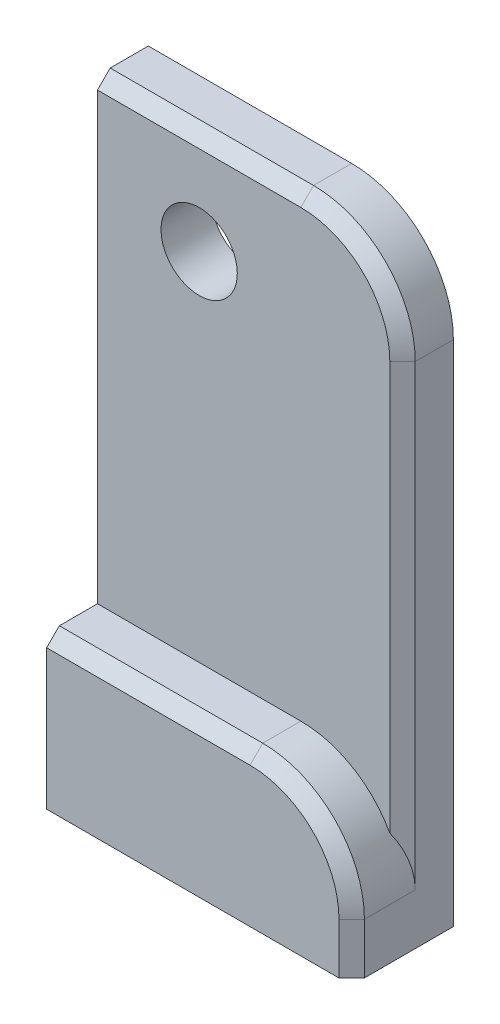
ISO-10303-21;
HEADER;
FILE_DESCRIPTION(('STEP AP214'),'2;1');
FILE_NAME('part.step','',(''),(''),'','','');
FILE_SCHEMA(('AUTOMOTIVE_DESIGN { 1 0 10303 214 1 1 1 1 }'));
ENDSEC;
DATA;
#1=APPLICATION_CONTEXT('core data for automotive mechanical design processes');
#2=APPLICATION_PROTOCOL_DEFINITION('international standard','automotive_design',2000,#1);
#3=PRODUCT_CONTEXT('',#1,'mechanical');
#4=PRODUCT('Part','Part','',(#3));
#5=PRODUCT_RELATED_PRODUCT_CATEGORY('part','',(#4));
#6=PRODUCT_DEFINITION_FORMATION('','',#4);
#7=PRODUCT_DEFINITION_CONTEXT('part definition',#1,'design');
#8=PRODUCT_DEFINITION('design','',#6,#7);
#9=PRODUCT_DEFINITION_SHAPE('','',#8);
#10=(LENGTH_UNIT() NAMED_UNIT(*) SI_UNIT(.MILLI.,.METRE.));
#11=(NAMED_UNIT(*) PLANE_ANGLE_UNIT() SI_UNIT($,.RADIAN.));
#12=(NAMED_UNIT(*) SI_UNIT($,.STERADIAN.) SOLID_ANGLE_UNIT());
#13=UNCERTAINTY_MEASURE_WITH_UNIT(LENGTH_MEASURE(1.E-05),#10,'distance_accuracy_value','');
#14=(GEOMETRIC_REPRESENTATION_CONTEXT(3) GLOBAL_UNCERTAINTY_ASSIGNED_CONTEXT((#13)) GLOBAL_UNIT_ASSIGNED_CONTEXT((#10,
#11,#12)) REPRESENTATION_CONTEXT('',''));
#15=CARTESIAN_POINT('',(0.,0.,0.));
#16=DIRECTION('',(0.,0.,1.));
#17=DIRECTION('',(1.,0.,0.));
#18=AXIS2_PLACEMENT_3D('',#15,#16,#17);
#19=CARTESIAN_POINT('',(0.,0.,12.7));
#20=DIRECTION('',(-1.,0.,0.));
#21=DIRECTION('',(0.,0.,1.));
#22=AXIS2_PLACEMENT_3D('',#19,#20,#21);
#23=PLANE('',#22);
#24=DIRECTION('',(0.,-0.707106781186544,0.707106781186551));
#25=VECTOR('',#24,1.);
#26=CARTESIAN_POINT('',(0.,22.0164487757863,34.7164487757861));
#27=LINE('',#26,#25);
#28=CARTESIAN_POINT('',(0.,33.8728975515724,22.86));
#29=VERTEX_POINT('',#28);
#30=CARTESIAN_POINT('',(0.,35.56,21.1728975515723));
#31=VERTEX_POINT('',#30);
#32=EDGE_CURVE('E270',#29,#31,#27,.F.);
#33=ORIENTED_EDGE('',*,*,#32,.F.);
#34=DIRECTION('',(0.,-1.,0.));
#35=VECTOR('',#34,1.);
#36=CARTESIAN_POINT('',(0.,0.,22.86));
#37=LINE('',#36,#35);
#38=CARTESIAN_POINT('',(0.,0.,22.86));
#39=VERTEX_POINT('',#38);
#40=EDGE_CURVE('E268',#29,#39,#37,.T.);
#41=ORIENTED_EDGE('',*,*,#40,.T.);
#42=DIRECTION('',(0.,0.,-1.));
#43=VECTOR('',#42,1.);
#44=CARTESIAN_POINT('',(0.,0.,12.7));
#45=LINE('',#44,#43);
#46=CARTESIAN_POINT('',(0.,0.,25.4));
#47=VERTEX_POINT('',#46);
#48=EDGE_CURVE('E339',#47,#39,#45,.T.);
#49=ORIENTED_EDGE('',*,*,#48,.F.);
#50=DIRECTION('',(0.,-1.,0.));
#51=VECTOR('',#50,1.);
#52=CARTESIAN_POINT('',(0.,0.,25.4));
#53=LINE('',#52,#51);
#54=CARTESIAN_POINT('',(0.,34.925,25.4));
#55=VERTEX_POINT('',#54);
#56=EDGE_CURVE('E312',#55,#47,#53,.T.);
#57=ORIENTED_EDGE('',*,*,#56,.F.);
#58=DIRECTION('',(0.,-0.707106781186544,0.707106781186551));
#59=VECTOR('',#58,1.);
#60=CARTESIAN_POINT('',(0.,23.8125000000002,36.5125));
#61=LINE('',#60,#59);
#62=CARTESIAN_POINT('',(0.,38.1,22.225));
#63=VERTEX_POINT('',#62);
#64=EDGE_CURVE('E376',#55,#63,#61,.F.);
#65=ORIENTED_EDGE('',*,*,#64,.T.);
#66=DIRECTION('',(0.,0.,-1.));
#67=VECTOR('',#66,1.);
#68=CARTESIAN_POINT('',(0.,38.1,25.4));
#69=LINE('',#68,#67);
#70=CARTESIAN_POINT('',(0.,38.1,12.7));
#71=VERTEX_POINT('',#70);
#72=EDGE_CURVE('E317',#63,#71,#69,.T.);
#73=ORIENTED_EDGE('',*,*,#72,.T.);
#74=DIRECTION('',(0.,1.,0.));
#75=VECTOR('',#74,1.);
#76=CARTESIAN_POINT('',(0.,0.,12.7));
#77=LINE('',#76,#75);
#78=CARTESIAN_POINT('',(0.,149.225,12.7));
#79=VERTEX_POINT('',#78);
#80=EDGE_CURVE('E322',#71,#79,#77,.T.);
#81=ORIENTED_EDGE('',*,*,#80,.T.);
#82=DIRECTION('',(0.,-0.707106781186549,0.707106781186546));
#83=VECTOR('',#82,1.);
#84=CARTESIAN_POINT('',(0.,74.6124999999997,87.3125));
#85=LINE('',#84,#83);
#86=CARTESIAN_POINT('',(0.,152.4,9.52499999999995));
#87=VERTEX_POINT('',#86);
#88=EDGE_CURVE('E374',#79,#87,#85,.F.);
#89=ORIENTED_EDGE('',*,*,#88,.T.);
#90=DIRECTION('',(0.,0.,-1.));
#91=VECTOR('',#90,1.);
#92=CARTESIAN_POINT('',(0.,152.4,12.7));
#93=LINE('',#92,#91);
#94=CARTESIAN_POINT('',(0.,152.4,0.));
#95=VERTEX_POINT('',#94);
#96=EDGE_CURVE('E335',#87,#95,#93,.T.);
#97=ORIENTED_EDGE('',*,*,#96,.T.);
#98=DIRECTION('',(0.,1.,0.));
#99=VECTOR('',#98,1.);
#100=CARTESIAN_POINT('',(0.,0.,0.));
#101=LINE('',#100,#99);
#102=CARTESIAN_POINT('',(0.,149.86,0.));
#103=VERTEX_POINT('',#102);
#104=EDGE_CURVE('E326',#103,#95,#101,.T.);
#105=ORIENTED_EDGE('',*,*,#104,.F.);
#106=DIRECTION('',(0.,0.,-1.));
#107=VECTOR('',#106,1.);
#108=CARTESIAN_POINT('',(0.,149.86,12.7));
#109=LINE('',#108,#107);
#110=CARTESIAN_POINT('',(0.,149.86,8.47289755157226));
#111=VERTEX_POINT('',#110);
#112=EDGE_CURVE('E247',#111,#103,#109,.T.);
#113=ORIENTED_EDGE('',*,*,#112,.F.);
#114=DIRECTION('',(0.,-0.707106781186549,0.707106781186546));
#115=VECTOR('',#114,1.);
#116=CARTESIAN_POINT('',(0.,72.8164487757858,85.5164487757861));
#117=LINE('',#116,#115);
#118=CARTESIAN_POINT('',(0.,148.172897551572,10.16));
#119=VERTEX_POINT('',#118);
#120=EDGE_CURVE('E204',#119,#111,#117,.F.);
#121=ORIENTED_EDGE('',*,*,#120,.F.);
#122=DIRECTION('',(0.,1.,0.));
#123=VECTOR('',#122,1.);
#124=CARTESIAN_POINT('',(0.,0.,10.16));
#125=LINE('',#124,#123);
#126=CARTESIAN_POINT('',(0.,35.56,10.16));
#127=VERTEX_POINT('',#126);
#128=EDGE_CURVE('E288',#127,#119,#125,.T.);
#129=ORIENTED_EDGE('',*,*,#128,.F.);
#130=DIRECTION('',(0.,0.,-1.));
#131=VECTOR('',#130,1.);
#132=CARTESIAN_POINT('',(0.,35.56,25.4));
#133=LINE('',#132,#131);
#134=EDGE_CURVE('E284',#31,#127,#133,.T.);
#135=ORIENTED_EDGE('',*,*,#134,.F.);
#136=EDGE_LOOP('',(#33,#41,#49,#57,#65,#73,#81,#89,#97,#105,#113,#121,#129,#135));
#137=FACE_BOUND('',#136,.T.);
#138=ADVANCED_FACE('F40',(#137),#23,.T.);
#139=CARTESIAN_POINT('',(0.,0.,0.));
#140=DIRECTION('',(0.,0.,1.));
#141=DIRECTION('',(1.,0.,0.));
#142=AXIS2_PLACEMENT_3D('',#139,#140,#141);
#143=PLANE('',#142);
#144=CARTESIAN_POINT('',(25.4,127.,0.));
#145=DIRECTION('',(0.,0.,1.));
#146=DIRECTION('',(1.,0.,0.));
#147=AXIS2_PLACEMENT_3D('',#144,#145,#146);
#148=CIRCLE('',#147,9.525);
#149=CARTESIAN_POINT('',(34.925,127.,0.));
#150=VERTEX_POINT('',#149);
#151=EDGE_CURVE('E304',#150,#150,#148,.T.);
#152=ORIENTED_EDGE('',*,*,#151,.T.);
#153=EDGE_LOOP('',(#152));
#154=FACE_BOUND('',#153,.T.);
#155=CARTESIAN_POINT('',(25.4,127.,0.));
#156=DIRECTION('',(0.,0.,1.));
#157=DIRECTION('',(1.,0.,0.));
#158=AXIS2_PLACEMENT_3D('',#155,#156,#157);
#159=CIRCLE('',#158,12.065);
#160=CARTESIAN_POINT('',(37.465,127.,0.));
#161=VERTEX_POINT('',#160);
#162=EDGE_CURVE('E258',#161,#161,#159,.T.);
#163=ORIENTED_EDGE('',*,*,#162,.F.);
#164=EDGE_LOOP('',(#163));
#165=FACE_BOUND('',#164,.T.);
#166=ADVANCED_FACE('F486',(#154,#165),#143,.F.);
#167=DIRECTION('',(1.,0.,0.));
#168=VECTOR('',#167,1.);
#169=CARTESIAN_POINT('',(0.,149.86,0.));
#170=LINE('',#169,#168);
#171=CARTESIAN_POINT('',(50.8,149.86,0.));
#172=VERTEX_POINT('',#171);
#173=EDGE_CURVE('E214',#103,#172,#170,.T.);
#174=ORIENTED_EDGE('',*,*,#173,.F.);
#175=ORIENTED_EDGE('',*,*,#104,.T.);
#176=DIRECTION('',(1.,0.,0.));
#177=VECTOR('',#176,1.);
#178=CARTESIAN_POINT('',(0.,152.4,0.));
#179=LINE('',#178,#177);
#180=CARTESIAN_POINT('',(50.8,152.4,0.));
#181=VERTEX_POINT('',#180);
#182=EDGE_CURVE('E321',#95,#181,#179,.T.);
#183=ORIENTED_EDGE('',*,*,#182,.T.);
#184=CARTESIAN_POINT('',(50.8,127.,0.));
#185=DIRECTION('',(0.,0.,1.));
#186=DIRECTION('',(1.,0.,0.));
#187=AXIS2_PLACEMENT_3D('',#184,#185,#186);
#188=CIRCLE('',#187,25.4);
#189=CARTESIAN_POINT('',(76.2,127.,0.));
#190=VERTEX_POINT('',#189);
#191=EDGE_CURVE('E353',#181,#190,#188,.F.);
#192=ORIENTED_EDGE('',*,*,#191,.T.);
#193=DIRECTION('',(0.,1.,0.));
#194=VECTOR('',#193,1.);
#195=CARTESIAN_POINT('',(76.2,0.,0.));
#196=LINE('',#195,#194);
#197=CARTESIAN_POINT('',(76.2,0.,0.));
#198=VERTEX_POINT('',#197);
#199=EDGE_CURVE('E329',#198,#190,#196,.T.);
#200=ORIENTED_EDGE('',*,*,#199,.F.);
#201=DIRECTION('',(1.,0.,0.));
#202=VECTOR('',#201,1.);
#203=CARTESIAN_POINT('',(0.,0.,0.));
#204=LINE('',#203,#202);
#205=CARTESIAN_POINT('',(73.66,0.,0.));
#206=VERTEX_POINT('',#205);
#207=EDGE_CURVE('E332',#206,#198,#204,.T.);
#208=ORIENTED_EDGE('',*,*,#207,.F.);
#209=DIRECTION('',(0.,1.,0.));
#210=VECTOR('',#209,1.);
#211=CARTESIAN_POINT('',(73.66,0.,0.));
#212=LINE('',#211,#210);
#213=CARTESIAN_POINT('',(73.66,127.,0.));
#214=VERTEX_POINT('',#213);
#215=EDGE_CURVE('E283',#206,#214,#212,.T.);
#216=ORIENTED_EDGE('',*,*,#215,.T.);
#217=CARTESIAN_POINT('',(50.8,127.,0.));
#218=DIRECTION('',(0.,0.,1.));
#219=DIRECTION('',(1.,0.,0.));
#220=AXIS2_PLACEMENT_3D('',#217,#218,#219);
#221=CIRCLE('',#220,22.86);
#222=EDGE_CURVE('E218',#172,#214,#221,.F.);
#223=ORIENTED_EDGE('',*,*,#222,.F.);
#224=EDGE_LOOP('',(#174,#175,#183,#192,#200,#208,#216,#223));
#225=FACE_BOUND('',#224,.T.);
#226=ADVANCED_FACE('F436',(#225),#143,.F.);
#227=CARTESIAN_POINT('',(0.,152.4,12.7));
#228=DIRECTION('',(0.,1.,0.));
#229=DIRECTION('',(0.,0.,1.));
#230=AXIS2_PLACEMENT_3D('',#227,#228,#229);
#231=PLANE('',#230);
#232=ORIENTED_EDGE('',*,*,#96,.F.);
#233=DIRECTION('',(1.,0.,0.));
#234=VECTOR('',#233,1.);
#235=CARTESIAN_POINT('',(0.,152.4,9.52499999999995));
#236=LINE('',#235,#234);
#237=CARTESIAN_POINT('',(50.8,152.4,9.52499999999995));
#238=VERTEX_POINT('',#237);
#239=EDGE_CURVE('E50',#87,#238,#236,.T.);
#240=ORIENTED_EDGE('',*,*,#239,.T.);
#241=DIRECTION('',(0.,0.,-1.));
#242=VECTOR('',#241,1.);
#243=CARTESIAN_POINT('',(50.8,152.4,0.));
#244=LINE('',#243,#242);
#245=EDGE_CURVE('E351',#238,#181,#244,.T.);
#246=ORIENTED_EDGE('',*,*,#245,.T.);
#247=ORIENTED_EDGE('',*,*,#182,.F.);
#248=EDGE_LOOP('',(#232,#240,#246,#247));
#249=FACE_BOUND('',#248,.T.);
#250=ADVANCED_FACE('F434',(#249),#231,.T.);
#251=CARTESIAN_POINT('',(0.,0.,12.7));
#252=DIRECTION('',(0.,1.,0.));
#253=DIRECTION('',(0.,0.,1.));
#254=AXIS2_PLACEMENT_3D('',#251,#252,#253);
#255=PLANE('',#254);
#256=DIRECTION('',(0.707106781186544,0.,-0.707106781186551));
#257=VECTOR('',#256,1.);
#258=CARTESIAN_POINT('',(71.2289487757862,0.,23.6039487757862));
#259=LINE('',#258,#257);
#260=CARTESIAN_POINT('',(73.66,0.,21.1728975515724));
#261=VERTEX_POINT('',#260);
#262=CARTESIAN_POINT('',(71.9728975515724,0.,22.86));
#263=VERTEX_POINT('',#262);
#264=EDGE_CURVE('E241',#261,#263,#259,.F.);
#265=ORIENTED_EDGE('',*,*,#264,.F.);
#266=DIRECTION('',(0.,0.,-1.));
#267=VECTOR('',#266,1.);
#268=CARTESIAN_POINT('',(73.66,0.,12.7));
#269=LINE('',#268,#267);
#270=EDGE_CURVE('E281',#261,#206,#269,.T.);
#271=ORIENTED_EDGE('',*,*,#270,.T.);
#272=ORIENTED_EDGE('',*,*,#207,.T.);
#273=DIRECTION('',(0.,0.,-1.));
#274=VECTOR('',#273,1.);
#275=CARTESIAN_POINT('',(76.2,0.,12.7));
#276=LINE('',#275,#274);
#277=CARTESIAN_POINT('',(76.2,0.,22.225));
#278=VERTEX_POINT('',#277);
#279=EDGE_CURVE('E325',#278,#198,#276,.T.);
#280=ORIENTED_EDGE('',*,*,#279,.F.);
#281=DIRECTION('',(0.707106781186544,0.,-0.707106781186551));
#282=VECTOR('',#281,1.);
#283=CARTESIAN_POINT('',(73.025,0.,25.4));
#284=LINE('',#283,#282);
#285=CARTESIAN_POINT('',(73.025,0.,25.4));
#286=VERTEX_POINT('',#285);
#287=EDGE_CURVE('E370',#278,#286,#284,.F.);
#288=ORIENTED_EDGE('',*,*,#287,.T.);
#289=DIRECTION('',(1.,0.,0.));
#290=VECTOR('',#289,1.);
#291=CARTESIAN_POINT('',(0.,0.,25.4));
#292=LINE('',#291,#290);
#293=EDGE_CURVE('E314',#47,#286,#292,.T.);
#294=ORIENTED_EDGE('',*,*,#293,.F.);
#295=ORIENTED_EDGE('',*,*,#48,.T.);
#296=DIRECTION('',(1.,0.,0.));
#297=VECTOR('',#296,1.);
#298=CARTESIAN_POINT('',(0.,0.,22.86));
#299=LINE('',#298,#297);
#300=EDGE_CURVE('E292',#39,#263,#299,.T.);
#301=ORIENTED_EDGE('',*,*,#300,.T.);
#302=EDGE_LOOP('',(#265,#271,#272,#280,#288,#294,#295,#301));
#303=FACE_BOUND('',#302,.T.);
#304=ADVANCED_FACE('F459',(#303),#255,.F.);
#305=CARTESIAN_POINT('',(76.2,0.,12.7));
#306=DIRECTION('',(-1.,0.,0.));
#307=DIRECTION('',(0.,0.,1.));
#308=AXIS2_PLACEMENT_3D('',#305,#306,#307);
#309=PLANE('',#308);
#310=DIRECTION('',(0.,0.,-1.));
#311=VECTOR('',#310,1.);
#312=CARTESIAN_POINT('',(76.2,12.7,12.7));
#313=LINE('',#312,#311);
#314=CARTESIAN_POINT('',(76.2,12.7,9.52499999999995));
#315=VERTEX_POINT('',#314);
#316=CARTESIAN_POINT('',(76.2,12.7,22.225));
#317=VERTEX_POINT('',#316);
#318=EDGE_CURVE('E348',#315,#317,#313,.F.);
#319=ORIENTED_EDGE('',*,*,#318,.T.);
#320=DIRECTION('',(0.,-1.,0.));
#321=VECTOR('',#320,1.);
#322=CARTESIAN_POINT('',(76.2,0.,22.225));
#323=LINE('',#322,#321);
#324=EDGE_CURVE('E368',#317,#278,#323,.T.);
#325=ORIENTED_EDGE('',*,*,#324,.T.);
#326=ORIENTED_EDGE('',*,*,#279,.T.);
#327=ORIENTED_EDGE('',*,*,#199,.T.);
#328=DIRECTION('',(0.,0.,-1.));
#329=VECTOR('',#328,1.);
#330=CARTESIAN_POINT('',(76.2,127.,12.7));
#331=LINE('',#330,#329);
#332=CARTESIAN_POINT('',(76.2,127.,9.52499999999995));
#333=VERTEX_POINT('',#332);
#334=EDGE_CURVE('E345',#190,#333,#331,.F.);
#335=ORIENTED_EDGE('',*,*,#334,.T.);
#336=DIRECTION('',(0.,-1.,0.));
#337=VECTOR('',#336,1.);
#338=CARTESIAN_POINT('',(76.2,12.7,9.52499999999995));
#339=LINE('',#338,#337);
#340=EDGE_CURVE('E365',#333,#315,#339,.T.);
#341=ORIENTED_EDGE('',*,*,#340,.T.);
#342=EDGE_LOOP('',(#319,#325,#326,#327,#335,#341));
#343=FACE_BOUND('',#342,.T.);
#344=ADVANCED_FACE('F427',(#343),#309,.F.);
#345=CARTESIAN_POINT('',(0.,0.,12.7));
#346=DIRECTION('',(0.,0.,1.));
#347=DIRECTION('',(1.,0.,0.));
#348=AXIS2_PLACEMENT_3D('',#345,#346,#347);
#349=PLANE('',#348);
#350=CARTESIAN_POINT('',(25.4,127.,12.7));
#351=DIRECTION('',(0.,0.,1.));
#352=DIRECTION('',(1.,0.,0.));
#353=AXIS2_PLACEMENT_3D('',#350,#351,#352);
#354=CIRCLE('',#353,9.525);
#355=CARTESIAN_POINT('',(34.925,127.,12.7));
#356=VERTEX_POINT('',#355);
#357=EDGE_CURVE('E308',#356,#356,#354,.T.);
#358=ORIENTED_EDGE('',*,*,#357,.F.);
#359=EDGE_LOOP('',(#358));
#360=FACE_BOUND('',#359,.T.);
#361=CARTESIAN_POINT('',(50.8,12.7,12.7));
#362=DIRECTION('',(0.,0.,1.));
#363=DIRECTION('',(1.,0.,0.));
#364=AXIS2_PLACEMENT_3D('',#361,#362,#363);
#365=CIRCLE('',#364,25.4);
#366=CARTESIAN_POINT('',(50.8,38.1,12.7));
#367=VERTEX_POINT('',#366);
#368=CARTESIAN_POINT('',(73.0249999999999,24.9967221242087,12.7));
#369=VERTEX_POINT('',#368);
#370=EDGE_CURVE('E355',#367,#369,#365,.F.);
#371=ORIENTED_EDGE('',*,*,#370,.T.);
#372=DIRECTION('',(0.,1.,0.));
#373=VECTOR('',#372,1.);
#374=CARTESIAN_POINT('',(73.0249999999999,127.,12.7));
#375=LINE('',#374,#373);
#376=CARTESIAN_POINT('',(73.0249999999999,127.,12.7));
#377=VERTEX_POINT('',#376);
#378=EDGE_CURVE('E384',#369,#377,#375,.T.);
#379=ORIENTED_EDGE('',*,*,#378,.T.);
#380=CARTESIAN_POINT('',(50.8,127.,12.7));
#381=DIRECTION('',(0.,0.,1.));
#382=DIRECTION('',(1.,0.,0.));
#383=AXIS2_PLACEMENT_3D('',#380,#381,#382);
#384=CIRCLE('',#383,22.2249999999999);
#385=CARTESIAN_POINT('',(50.8,149.225,12.7));
#386=VERTEX_POINT('',#385);
#387=EDGE_CURVE('E382',#377,#386,#384,.T.);
#388=ORIENTED_EDGE('',*,*,#387,.T.);
#389=DIRECTION('',(-1.,0.,0.));
#390=VECTOR('',#389,1.);
#391=CARTESIAN_POINT('',(0.,149.225,12.7));
#392=LINE('',#391,#390);
#393=EDGE_CURVE('E380',#386,#79,#392,.T.);
#394=ORIENTED_EDGE('',*,*,#393,.T.);
#395=ORIENTED_EDGE('',*,*,#80,.F.);
#396=DIRECTION('',(-1.,0.,0.));
#397=VECTOR('',#396,1.);
#398=CARTESIAN_POINT('',(0.,38.1,12.7));
#399=LINE('',#398,#397);
#400=EDGE_CURVE('E307',#367,#71,#399,.T.);
#401=ORIENTED_EDGE('',*,*,#400,.F.);
#402=EDGE_LOOP('',(#371,#379,#388,#394,#395,#401));
#403=FACE_BOUND('',#402,.T.);
#404=ADVANCED_FACE('F408',(#360,#403),#349,.T.);
#405=CARTESIAN_POINT('',(0.,38.1,25.4));
#406=DIRECTION('',(0.,-1.,0.));
#407=DIRECTION('',(0.,0.,-1.));
#408=AXIS2_PLACEMENT_3D('',#405,#406,#407);
#409=PLANE('',#408);
#410=ORIENTED_EDGE('',*,*,#72,.F.);
#411=DIRECTION('',(1.,0.,0.));
#412=VECTOR('',#411,1.);
#413=CARTESIAN_POINT('',(0.,38.1,22.225));
#414=LINE('',#413,#412);
#415=CARTESIAN_POINT('',(50.8,38.1,22.225));
#416=VERTEX_POINT('',#415);
#417=EDGE_CURVE('E378',#63,#416,#414,.T.);
#418=ORIENTED_EDGE('',*,*,#417,.T.);
#419=DIRECTION('',(0.,0.,-1.));
#420=VECTOR('',#419,1.);
#421=CARTESIAN_POINT('',(50.8,38.1,25.4));
#422=LINE('',#421,#420);
#423=EDGE_CURVE('E338',#416,#367,#422,.T.);
#424=ORIENTED_EDGE('',*,*,#423,.T.);
#425=ORIENTED_EDGE('',*,*,#400,.T.);
#426=EDGE_LOOP('',(#410,#418,#424,#425));
#427=FACE_BOUND('',#426,.T.);
#428=ADVANCED_FACE('F417',(#427),#409,.F.);
#429=CARTESIAN_POINT('',(0.,0.,25.4));
#430=DIRECTION('',(0.,0.,-1.));
#431=DIRECTION('',(-1.,0.,0.));
#432=AXIS2_PLACEMENT_3D('',#429,#430,#431);
#433=PLANE('',#432);
#434=ORIENTED_EDGE('',*,*,#293,.T.);
#435=DIRECTION('',(0.,1.,0.));
#436=VECTOR('',#435,1.);
#437=CARTESIAN_POINT('',(73.025,0.,25.4));
#438=LINE('',#437,#436);
#439=CARTESIAN_POINT('',(73.025,12.7,25.4));
#440=VERTEX_POINT('',#439);
#441=EDGE_CURVE('E362',#286,#440,#438,.T.);
#442=ORIENTED_EDGE('',*,*,#441,.T.);
#443=CARTESIAN_POINT('',(50.8,12.7,25.4));
#444=DIRECTION('',(0.,0.,-1.));
#445=DIRECTION('',(-1.,0.,0.));
#446=AXIS2_PLACEMENT_3D('',#443,#444,#445);
#447=CIRCLE('',#446,22.225);
#448=CARTESIAN_POINT('',(50.8,34.925,25.4));
#449=VERTEX_POINT('',#448);
#450=EDGE_CURVE('E360',#440,#449,#447,.F.);
#451=ORIENTED_EDGE('',*,*,#450,.T.);
#452=DIRECTION('',(-1.,0.,0.));
#453=VECTOR('',#452,1.);
#454=CARTESIAN_POINT('',(0.,34.925,25.4));
#455=LINE('',#454,#453);
#456=EDGE_CURVE('E358',#449,#55,#455,.T.);
#457=ORIENTED_EDGE('',*,*,#456,.T.);
#458=ORIENTED_EDGE('',*,*,#56,.T.);
#459=EDGE_LOOP('',(#434,#442,#451,#457,#458));
#460=FACE_BOUND('',#459,.T.);
#461=ADVANCED_FACE('F464',(#460),#433,.F.);
#462=CARTESIAN_POINT('',(25.4,127.,0.));
#463=DIRECTION('',(0.,0.,1.));
#464=DIRECTION('',(1.,0.,0.));
#465=AXIS2_PLACEMENT_3D('',#462,#463,#464);
#466=CYLINDRICAL_SURFACE('',#465,9.525);
#467=ORIENTED_EDGE('',*,*,#151,.F.);
#468=EDGE_LOOP('',(#467));
#469=FACE_BOUND('',#468,.T.);
#470=ORIENTED_EDGE('',*,*,#357,.T.);
#471=EDGE_LOOP('',(#470));
#472=FACE_BOUND('',#471,.T.);
#473=ADVANCED_FACE('F502',(#469,#472),#466,.F.);
#474=CARTESIAN_POINT('',(50.8,12.7,25.4));
#475=DIRECTION('',(0.,0.,-1.));
#476=DIRECTION('',(-1.,0.,0.));
#477=AXIS2_PLACEMENT_3D('',#474,#475,#476);
#478=CYLINDRICAL_SURFACE('',#477,25.4);
#479=ORIENTED_EDGE('',*,*,#423,.F.);
#480=CARTESIAN_POINT('',(50.8,12.7,22.225));
#481=DIRECTION('',(0.,0.,-1.));
#482=DIRECTION('',(-1.,0.,0.));
#483=AXIS2_PLACEMENT_3D('',#480,#481,#482);
#484=CIRCLE('',#483,25.4);
#485=EDGE_CURVE('E372',#416,#317,#484,.T.);
#486=ORIENTED_EDGE('',*,*,#485,.T.);
#487=ORIENTED_EDGE('',*,*,#318,.F.);
#488=CARTESIAN_POINT('',(50.8,12.7,34.9249999999998));
#489=DIRECTION('',(0.707106781186546,0.,0.707106781186549));
#490=DIRECTION('',(0.707106781186549,0.,-0.707106781186546));
#491=AXIS2_PLACEMENT_3D('',#488,#489,#490);
#492=ELLIPSE('',#491,35.9210244842765,25.4);
#493=EDGE_CURVE('E11',#315,#369,#492,.T.);
#494=ORIENTED_EDGE('',*,*,#493,.T.);
#495=ORIENTED_EDGE('',*,*,#370,.F.);
#496=EDGE_LOOP('',(#479,#486,#487,#494,#495));
#497=FACE_BOUND('',#496,.T.);
#498=ADVANCED_FACE('F423',(#497),#478,.T.);
#499=CARTESIAN_POINT('',(50.8,127.,12.7));
#500=DIRECTION('',(0.,0.,1.));
#501=DIRECTION('',(1.,0.,0.));
#502=AXIS2_PLACEMENT_3D('',#499,#500,#501);
#503=CYLINDRICAL_SURFACE('',#502,25.4);
#504=ORIENTED_EDGE('',*,*,#245,.F.);
#505=CARTESIAN_POINT('',(50.8,127.,9.52499999999995));
#506=DIRECTION('',(0.,0.,1.));
#507=DIRECTION('',(1.,0.,0.));
#508=AXIS2_PLACEMENT_3D('',#505,#506,#507);
#509=CIRCLE('',#508,25.4);
#510=EDGE_CURVE('E387',#238,#333,#509,.F.);
#511=ORIENTED_EDGE('',*,*,#510,.T.);
#512=ORIENTED_EDGE('',*,*,#334,.F.);
#513=ORIENTED_EDGE('',*,*,#191,.F.);
#514=EDGE_LOOP('',(#504,#511,#512,#513));
#515=FACE_BOUND('',#514,.T.);
#516=ADVANCED_FACE('F432',(#515),#503,.T.);
#517=CARTESIAN_POINT('',(0.,34.925,25.4));
#518=DIRECTION('',(0.,-0.707106781186551,-0.707106781186544));
#519=DIRECTION('',(-1.,0.,0.));
#520=AXIS2_PLACEMENT_3D('',#517,#518,#519);
#521=PLANE('',#520);
#522=ORIENTED_EDGE('',*,*,#64,.F.);
#523=ORIENTED_EDGE('',*,*,#456,.F.);
#524=DIRECTION('',(0.,-0.707106781186544,0.707106781186551));
#525=VECTOR('',#524,1.);
#526=CARTESIAN_POINT('',(50.8,38.1,22.225));
#527=LINE('',#526,#525);
#528=EDGE_CURVE('E311',#416,#449,#527,.T.);
#529=ORIENTED_EDGE('',*,*,#528,.F.);
#530=ORIENTED_EDGE('',*,*,#417,.F.);
#531=EDGE_LOOP('',(#522,#523,#529,#530));
#532=FACE_BOUND('',#531,.T.);
#533=ADVANCED_FACE('F474',(#532),#521,.F.);
#534=CARTESIAN_POINT('',(50.8,12.7,25.4));
#535=DIRECTION('',(0.,0.,-1.));
#536=DIRECTION('',(-1.,0.,0.));
#537=AXIS2_PLACEMENT_3D('',#534,#535,#536);
#538=CONICAL_SURFACE('',#537,22.225,0.785398163397444);
#539=ORIENTED_EDGE('',*,*,#528,.T.);
#540=ORIENTED_EDGE('',*,*,#450,.F.);
#541=DIRECTION('',(-0.707106781186544,0.,0.707106781186551));
#542=VECTOR('',#541,1.);
#543=CARTESIAN_POINT('',(76.2,12.7,22.225));
#544=LINE('',#543,#542);
#545=EDGE_CURVE('E390',#317,#440,#544,.T.);
#546=ORIENTED_EDGE('',*,*,#545,.F.);
#547=ORIENTED_EDGE('',*,*,#485,.F.);
#548=EDGE_LOOP('',(#539,#540,#546,#547));
#549=FACE_BOUND('',#548,.T.);
#550=ADVANCED_FACE('F470',(#549),#538,.T.);
#551=CARTESIAN_POINT('',(73.025,0.,25.4));
#552=DIRECTION('',(-0.707106781186551,0.,-0.707106781186544));
#553=DIRECTION('',(0.,1.,0.));
#554=AXIS2_PLACEMENT_3D('',#551,#552,#553);
#555=PLANE('',#554);
#556=ORIENTED_EDGE('',*,*,#287,.F.);
#557=ORIENTED_EDGE('',*,*,#324,.F.);
#558=ORIENTED_EDGE('',*,*,#545,.T.);
#559=ORIENTED_EDGE('',*,*,#441,.F.);
#560=EDGE_LOOP('',(#556,#557,#558,#559));
#561=FACE_BOUND('',#560,.T.);
#562=ADVANCED_FACE('F466',(#561),#555,.F.);
#563=CARTESIAN_POINT('',(0.,152.4,9.52499999999995));
#564=DIRECTION('',(0.,-0.707106781186546,-0.707106781186549));
#565=DIRECTION('',(1.,0.,0.));
#566=AXIS2_PLACEMENT_3D('',#563,#564,#565);
#567=PLANE('',#566);
#568=ORIENTED_EDGE('',*,*,#88,.F.);
#569=ORIENTED_EDGE('',*,*,#393,.F.);
#570=DIRECTION('',(0.,-0.707106781186549,0.707106781186546));
#571=VECTOR('',#570,1.);
#572=CARTESIAN_POINT('',(50.8,152.4,9.52499999999995));
#573=LINE('',#572,#571);
#574=EDGE_CURVE('E45',#238,#386,#573,.T.);
#575=ORIENTED_EDGE('',*,*,#574,.F.);
#576=ORIENTED_EDGE('',*,*,#239,.F.);
#577=EDGE_LOOP('',(#568,#569,#575,#576));
#578=FACE_BOUND('',#577,.T.);
#579=ADVANCED_FACE('F43',(#578),#567,.F.);
#580=CARTESIAN_POINT('',(50.8,127.,12.7));
#581=DIRECTION('',(0.,0.,-1.));
#582=DIRECTION('',(-1.,0.,0.));
#583=AXIS2_PLACEMENT_3D('',#580,#581,#582);
#584=CONICAL_SURFACE('',#583,22.2249999999999,0.78539816339745);
#585=ORIENTED_EDGE('',*,*,#574,.T.);
#586=ORIENTED_EDGE('',*,*,#387,.F.);
#587=DIRECTION('',(-0.707106781186549,0.,0.707106781186546));
#588=VECTOR('',#587,1.);
#589=CARTESIAN_POINT('',(76.2,127.,9.52499999999995));
#590=LINE('',#589,#588);
#591=EDGE_CURVE('E251',#333,#377,#590,.T.);
#592=ORIENTED_EDGE('',*,*,#591,.F.);
#593=ORIENTED_EDGE('',*,*,#510,.F.);
#594=EDGE_LOOP('',(#585,#586,#592,#593));
#595=FACE_BOUND('',#594,.T.);
#596=ADVANCED_FACE('F402',(#595),#584,.T.);
#597=CARTESIAN_POINT('',(73.0249999999999,0.,12.7));
#598=DIRECTION('',(0.707106781186546,0.,0.707106781186549));
#599=DIRECTION('',(0.,-1.,0.));
#600=AXIS2_PLACEMENT_3D('',#597,#598,#599);
#601=PLANE('',#600);
#602=ORIENTED_EDGE('',*,*,#493,.F.);
#603=ORIENTED_EDGE('',*,*,#340,.F.);
#604=ORIENTED_EDGE('',*,*,#591,.T.);
#605=ORIENTED_EDGE('',*,*,#378,.F.);
#606=EDGE_LOOP('',(#602,#603,#604,#605));
#607=FACE_BOUND('',#606,.T.);
#608=ADVANCED_FACE('F422',(#607),#601,.T.);
#609=CARTESIAN_POINT('',(0.,149.86,12.7));
#610=DIRECTION('',(0.,1.,0.));
#611=DIRECTION('',(0.,0.,1.));
#612=AXIS2_PLACEMENT_3D('',#609,#610,#611);
#613=PLANE('',#612);
#614=ORIENTED_EDGE('',*,*,#112,.T.);
#615=ORIENTED_EDGE('',*,*,#173,.T.);
#616=DIRECTION('',(0.,0.,1.));
#617=VECTOR('',#616,1.);
#618=CARTESIAN_POINT('',(50.8,149.86,12.7));
#619=LINE('',#618,#617);
#620=CARTESIAN_POINT('',(50.8,149.86,8.47289755157227));
#621=VERTEX_POINT('',#620);
#622=EDGE_CURVE('E211',#621,#172,#619,.F.);
#623=ORIENTED_EDGE('',*,*,#622,.F.);
#624=DIRECTION('',(-1.,0.,0.));
#625=VECTOR('',#624,1.);
#626=CARTESIAN_POINT('',(0.,149.86,8.47289755157226));
#627=LINE('',#626,#625);
#628=EDGE_CURVE('E198',#111,#621,#627,.F.);
#629=ORIENTED_EDGE('',*,*,#628,.F.);
#630=EDGE_LOOP('',(#614,#615,#623,#629));
#631=FACE_BOUND('',#630,.T.);
#632=ADVANCED_FACE('F212',(#631),#613,.F.);
#633=CARTESIAN_POINT('',(73.66,0.,12.7));
#634=DIRECTION('',(-1.,0.,0.));
#635=DIRECTION('',(0.,0.,1.));
#636=AXIS2_PLACEMENT_3D('',#633,#634,#635);
#637=PLANE('',#636);
#638=DIRECTION('',(0.,0.,1.));
#639=VECTOR('',#638,1.);
#640=CARTESIAN_POINT('',(73.66,12.7,12.7));
#641=LINE('',#640,#639);
#642=CARTESIAN_POINT('',(73.66,12.7,8.47289755157229));
#643=VERTEX_POINT('',#642);
#644=CARTESIAN_POINT('',(73.66,12.7,21.1728975515723));
#645=VERTEX_POINT('',#644);
#646=EDGE_CURVE('E219',#643,#645,#641,.T.);
#647=ORIENTED_EDGE('',*,*,#646,.F.);
#648=DIRECTION('',(0.,-1.,0.));
#649=VECTOR('',#648,1.);
#650=CARTESIAN_POINT('',(73.66,0.,8.47289755157229));
#651=LINE('',#650,#649);
#652=CARTESIAN_POINT('',(73.66,127.,8.47289755157229));
#653=VERTEX_POINT('',#652);
#654=EDGE_CURVE('E242',#653,#643,#651,.T.);
#655=ORIENTED_EDGE('',*,*,#654,.F.);
#656=DIRECTION('',(0.,0.,1.));
#657=VECTOR('',#656,1.);
#658=CARTESIAN_POINT('',(73.66,127.,12.7));
#659=LINE('',#658,#657);
#660=EDGE_CURVE('E58',#214,#653,#659,.T.);
#661=ORIENTED_EDGE('',*,*,#660,.F.);
#662=ORIENTED_EDGE('',*,*,#215,.F.);
#663=ORIENTED_EDGE('',*,*,#270,.F.);
#664=DIRECTION('',(0.,1.,0.));
#665=VECTOR('',#664,1.);
#666=CARTESIAN_POINT('',(73.66,0.,21.1728975515724));
#667=LINE('',#666,#665);
#668=EDGE_CURVE('E239',#645,#261,#667,.F.);
#669=ORIENTED_EDGE('',*,*,#668,.F.);
#670=EDGE_LOOP('',(#647,#655,#661,#662,#663,#669));
#671=FACE_BOUND('',#670,.T.);
#672=ADVANCED_FACE('F533',(#671),#637,.T.);
#673=CARTESIAN_POINT('',(0.,0.,10.16));
#674=DIRECTION('',(0.,0.,1.));
#675=DIRECTION('',(1.,0.,0.));
#676=AXIS2_PLACEMENT_3D('',#673,#674,#675);
#677=PLANE('',#676);
#678=CARTESIAN_POINT('',(25.4,127.,10.16));
#679=DIRECTION('',(0.,0.,1.));
#680=DIRECTION('',(1.,0.,0.));
#681=AXIS2_PLACEMENT_3D('',#678,#679,#680);
#682=CIRCLE('',#681,12.065);
#683=CARTESIAN_POINT('',(37.465,127.,10.16));
#684=VERTEX_POINT('',#683);
#685=EDGE_CURVE('E256',#684,#684,#682,.T.);
#686=ORIENTED_EDGE('',*,*,#685,.T.);
#687=EDGE_LOOP('',(#686));
#688=FACE_BOUND('',#687,.T.);
#689=CARTESIAN_POINT('',(50.8,12.7,10.16));
#690=DIRECTION('',(0.,0.,1.));
#691=DIRECTION('',(1.,0.,0.));
#692=AXIS2_PLACEMENT_3D('',#689,#690,#691);
#693=CIRCLE('',#692,22.86);
#694=CARTESIAN_POINT('',(50.8,35.56,10.16));
#695=VERTEX_POINT('',#694);
#696=CARTESIAN_POINT('',(71.9728975515723,21.3190492092009,10.16));
#697=VERTEX_POINT('',#696);
#698=EDGE_CURVE('E252',#695,#697,#693,.F.);
#699=ORIENTED_EDGE('',*,*,#698,.F.);
#700=DIRECTION('',(-1.,0.,0.));
#701=VECTOR('',#700,1.);
#702=CARTESIAN_POINT('',(0.,35.56,10.16));
#703=LINE('',#702,#701);
#704=EDGE_CURVE('E265',#695,#127,#703,.T.);
#705=ORIENTED_EDGE('',*,*,#704,.T.);
#706=ORIENTED_EDGE('',*,*,#128,.T.);
#707=DIRECTION('',(1.,0.,0.));
#708=VECTOR('',#707,1.);
#709=CARTESIAN_POINT('',(0.,148.172897551572,10.16));
#710=LINE('',#709,#708);
#711=CARTESIAN_POINT('',(50.8,148.172897551572,10.16));
#712=VERTEX_POINT('',#711);
#713=EDGE_CURVE('E262',#712,#119,#710,.F.);
#714=ORIENTED_EDGE('',*,*,#713,.F.);
#715=CARTESIAN_POINT('',(50.8,127.,10.16));
#716=DIRECTION('',(0.,0.,1.));
#717=DIRECTION('',(1.,0.,0.));
#718=AXIS2_PLACEMENT_3D('',#715,#716,#717);
#719=CIRCLE('',#718,21.1728975515723);
#720=CARTESIAN_POINT('',(71.9728975515723,127.,10.16));
#721=VERTEX_POINT('',#720);
#722=EDGE_CURVE('E224',#721,#712,#719,.T.);
#723=ORIENTED_EDGE('',*,*,#722,.F.);
#724=DIRECTION('',(0.,1.,0.));
#725=VECTOR('',#724,1.);
#726=CARTESIAN_POINT('',(71.9728975515723,0.,10.16));
#727=LINE('',#726,#725);
#728=EDGE_CURVE('E230',#697,#721,#727,.T.);
#729=ORIENTED_EDGE('',*,*,#728,.F.);
#730=EDGE_LOOP('',(#699,#705,#706,#714,#723,#729));
#731=FACE_BOUND('',#730,.T.);
#732=ADVANCED_FACE('F442',(#688,#731),#677,.F.);
#733=CARTESIAN_POINT('',(0.,35.56,25.4));
#734=DIRECTION('',(0.,-1.,0.));
#735=DIRECTION('',(0.,0.,-1.));
#736=AXIS2_PLACEMENT_3D('',#733,#734,#735);
#737=PLANE('',#736);
#738=ORIENTED_EDGE('',*,*,#134,.T.);
#739=ORIENTED_EDGE('',*,*,#704,.F.);
#740=DIRECTION('',(0.,0.,-1.));
#741=VECTOR('',#740,1.);
#742=CARTESIAN_POINT('',(50.8,35.56,25.4));
#743=LINE('',#742,#741);
#744=CARTESIAN_POINT('',(50.8,35.56,21.1728975515723));
#745=VERTEX_POINT('',#744);
#746=EDGE_CURVE('E236',#745,#695,#743,.T.);
#747=ORIENTED_EDGE('',*,*,#746,.F.);
#748=DIRECTION('',(-1.,0.,0.));
#749=VECTOR('',#748,1.);
#750=CARTESIAN_POINT('',(0.,35.56,21.1728975515723));
#751=LINE('',#750,#749);
#752=EDGE_CURVE('E264',#31,#745,#751,.F.);
#753=ORIENTED_EDGE('',*,*,#752,.F.);
#754=EDGE_LOOP('',(#738,#739,#747,#753));
#755=FACE_BOUND('',#754,.T.);
#756=ADVANCED_FACE('F447',(#755),#737,.T.);
#757=CARTESIAN_POINT('',(0.,0.,22.86));
#758=DIRECTION('',(0.,0.,-1.));
#759=DIRECTION('',(-1.,0.,0.));
#760=AXIS2_PLACEMENT_3D('',#757,#758,#759);
#761=PLANE('',#760);
#762=ORIENTED_EDGE('',*,*,#300,.F.);
#763=ORIENTED_EDGE('',*,*,#40,.F.);
#764=DIRECTION('',(1.,0.,0.));
#765=VECTOR('',#764,1.);
#766=CARTESIAN_POINT('',(0.,33.8728975515724,22.86));
#767=LINE('',#766,#765);
#768=CARTESIAN_POINT('',(50.8,33.8728975515724,22.86));
#769=VERTEX_POINT('',#768);
#770=EDGE_CURVE('E255',#769,#29,#767,.F.);
#771=ORIENTED_EDGE('',*,*,#770,.F.);
#772=CARTESIAN_POINT('',(50.8,12.7,22.86));
#773=DIRECTION('',(0.,0.,-1.));
#774=DIRECTION('',(-1.,0.,0.));
#775=AXIS2_PLACEMENT_3D('',#772,#773,#774);
#776=CIRCLE('',#775,21.1728975515724);
#777=CARTESIAN_POINT('',(71.9728975515724,12.7,22.86));
#778=VERTEX_POINT('',#777);
#779=EDGE_CURVE('E272',#778,#769,#776,.F.);
#780=ORIENTED_EDGE('',*,*,#779,.F.);
#781=DIRECTION('',(0.,-1.,0.));
#782=VECTOR('',#781,1.);
#783=CARTESIAN_POINT('',(71.9728975515724,0.,22.86));
#784=LINE('',#783,#782);
#785=EDGE_CURVE('E245',#263,#778,#784,.F.);
#786=ORIENTED_EDGE('',*,*,#785,.F.);
#787=EDGE_LOOP('',(#762,#763,#771,#780,#786));
#788=FACE_BOUND('',#787,.T.);
#789=ADVANCED_FACE('F545',(#788),#761,.T.);
#790=CARTESIAN_POINT('',(25.4,127.,0.));
#791=DIRECTION('',(0.,0.,1.));
#792=DIRECTION('',(1.,0.,0.));
#793=AXIS2_PLACEMENT_3D('',#790,#791,#792);
#794=CYLINDRICAL_SURFACE('',#793,12.065);
#795=ORIENTED_EDGE('',*,*,#162,.T.);
#796=EDGE_LOOP('',(#795));
#797=FACE_BOUND('',#796,.T.);
#798=ORIENTED_EDGE('',*,*,#685,.F.);
#799=EDGE_LOOP('',(#798));
#800=FACE_BOUND('',#799,.T.);
#801=ADVANCED_FACE('F548',(#797,#800),#794,.T.);
#802=CARTESIAN_POINT('',(50.8,12.7,25.4));
#803=DIRECTION('',(0.,0.,-1.));
#804=DIRECTION('',(-1.,0.,0.));
#805=AXIS2_PLACEMENT_3D('',#802,#803,#804);
#806=CYLINDRICAL_SURFACE('',#805,22.86);
#807=ORIENTED_EDGE('',*,*,#746,.T.);
#808=ORIENTED_EDGE('',*,*,#698,.T.);
#809=CARTESIAN_POINT('',(50.8,12.7,31.3328975515722));
#810=DIRECTION('',(0.707106781186546,0.,0.707106781186549));
#811=DIRECTION('',(0.707106781186549,0.,-0.707106781186546));
#812=AXIS2_PLACEMENT_3D('',#809,#810,#811);
#813=ELLIPSE('',#812,32.3289220358489,22.86);
#814=EDGE_CURVE('E207',#643,#697,#813,.T.);
#815=ORIENTED_EDGE('',*,*,#814,.F.);
#816=ORIENTED_EDGE('',*,*,#646,.T.);
#817=CARTESIAN_POINT('',(50.8,12.7,21.1728975515723));
#818=DIRECTION('',(0.,0.,-1.));
#819=DIRECTION('',(-1.,0.,0.));
#820=AXIS2_PLACEMENT_3D('',#817,#818,#819);
#821=CIRCLE('',#820,22.86);
#822=EDGE_CURVE('E248',#745,#645,#821,.T.);
#823=ORIENTED_EDGE('',*,*,#822,.F.);
#824=EDGE_LOOP('',(#807,#808,#815,#816,#823));
#825=FACE_BOUND('',#824,.T.);
#826=ADVANCED_FACE('F551',(#825),#806,.F.);
#827=CARTESIAN_POINT('',(50.8,127.,12.7));
#828=DIRECTION('',(0.,0.,1.));
#829=DIRECTION('',(1.,0.,0.));
#830=AXIS2_PLACEMENT_3D('',#827,#828,#829);
#831=CYLINDRICAL_SURFACE('',#830,22.86);
#832=ORIENTED_EDGE('',*,*,#622,.T.);
#833=ORIENTED_EDGE('',*,*,#222,.T.);
#834=ORIENTED_EDGE('',*,*,#660,.T.);
#835=CARTESIAN_POINT('',(50.8,127.,8.47289755157228));
#836=DIRECTION('',(0.,0.,-1.));
#837=DIRECTION('',(-1.,0.,0.));
#838=AXIS2_PLACEMENT_3D('',#835,#836,#837);
#839=CIRCLE('',#838,22.86);
#840=EDGE_CURVE('E208',#621,#653,#839,.T.);
#841=ORIENTED_EDGE('',*,*,#840,.F.);
#842=EDGE_LOOP('',(#832,#833,#834,#841));
#843=FACE_BOUND('',#842,.T.);
#844=ADVANCED_FACE('F229',(#843),#831,.F.);
#845=CARTESIAN_POINT('',(0.,33.1289487757862,23.6039487757862));
#846=DIRECTION('',(0.,-0.707106781186551,-0.707106781186544));
#847=DIRECTION('',(-1.,0.,0.));
#848=AXIS2_PLACEMENT_3D('',#845,#846,#847);
#849=PLANE('',#848);
#850=ORIENTED_EDGE('',*,*,#32,.T.);
#851=ORIENTED_EDGE('',*,*,#752,.T.);
#852=DIRECTION('',(0.,0.707106781186544,-0.707106781186551));
#853=VECTOR('',#852,1.);
#854=CARTESIAN_POINT('',(50.8,33.1289487757862,23.6039487757862));
#855=LINE('',#854,#853);
#856=EDGE_CURVE('E259',#745,#769,#855,.F.);
#857=ORIENTED_EDGE('',*,*,#856,.T.);
#858=ORIENTED_EDGE('',*,*,#770,.T.);
#859=EDGE_LOOP('',(#850,#851,#857,#858));
#860=FACE_BOUND('',#859,.T.);
#861=ADVANCED_FACE('F451',(#860),#849,.T.);
#862=CARTESIAN_POINT('',(50.8,12.7,23.6039487757862));
#863=DIRECTION('',(0.,0.,-1.));
#864=DIRECTION('',(-1.,0.,0.));
#865=AXIS2_PLACEMENT_3D('',#862,#863,#864);
#866=CONICAL_SURFACE('',#865,20.4289487757862,0.785398163397444);
#867=ORIENTED_EDGE('',*,*,#856,.F.);
#868=ORIENTED_EDGE('',*,*,#822,.T.);
#869=DIRECTION('',(0.707106781186544,0.,-0.707106781186551));
#870=VECTOR('',#869,1.);
#871=CARTESIAN_POINT('',(71.2289487757862,12.7,23.6039487757862));
#872=LINE('',#871,#870);
#873=EDGE_CURVE('E226',#645,#778,#872,.F.);
#874=ORIENTED_EDGE('',*,*,#873,.T.);
#875=ORIENTED_EDGE('',*,*,#779,.T.);
#876=EDGE_LOOP('',(#867,#868,#874,#875));
#877=FACE_BOUND('',#876,.T.);
#878=ADVANCED_FACE('F560',(#877),#866,.F.);
#879=CARTESIAN_POINT('',(71.2289487757862,0.,23.6039487757862));
#880=DIRECTION('',(-0.707106781186551,0.,-0.707106781186544));
#881=DIRECTION('',(0.,1.,0.));
#882=AXIS2_PLACEMENT_3D('',#879,#880,#881);
#883=PLANE('',#882);
#884=ORIENTED_EDGE('',*,*,#264,.T.);
#885=ORIENTED_EDGE('',*,*,#785,.T.);
#886=ORIENTED_EDGE('',*,*,#873,.F.);
#887=ORIENTED_EDGE('',*,*,#668,.T.);
#888=EDGE_LOOP('',(#884,#885,#886,#887));
#889=FACE_BOUND('',#888,.T.);
#890=ADVANCED_FACE('F563',(#889),#883,.T.);
#891=CARTESIAN_POINT('',(0.,150.603948775786,7.72894877578611));
#892=DIRECTION('',(0.,-0.707106781186546,-0.707106781186549));
#893=DIRECTION('',(1.,0.,0.));
#894=AXIS2_PLACEMENT_3D('',#891,#892,#893);
#895=PLANE('',#894);
#896=ORIENTED_EDGE('',*,*,#120,.T.);
#897=ORIENTED_EDGE('',*,*,#628,.T.);
#898=DIRECTION('',(0.,0.707106781186549,-0.707106781186546));
#899=VECTOR('',#898,1.);
#900=CARTESIAN_POINT('',(50.8,147.428948775786,10.9039487757862));
#901=LINE('',#900,#899);
#902=EDGE_CURVE('E202',#621,#712,#901,.F.);
#903=ORIENTED_EDGE('',*,*,#902,.T.);
#904=ORIENTED_EDGE('',*,*,#713,.T.);
#905=EDGE_LOOP('',(#896,#897,#903,#904));
#906=FACE_BOUND('',#905,.T.);
#907=ADVANCED_FACE('F200',(#906),#895,.T.);
#908=CARTESIAN_POINT('',(50.8,127.,10.9039487757862));
#909=DIRECTION('',(0.,0.,-1.));
#910=DIRECTION('',(-1.,0.,0.));
#911=AXIS2_PLACEMENT_3D('',#908,#909,#910);
#912=CONICAL_SURFACE('',#911,20.4289487757861,0.78539816339745);
#913=ORIENTED_EDGE('',*,*,#902,.F.);
#914=ORIENTED_EDGE('',*,*,#840,.T.);
#915=DIRECTION('',(0.707106781186549,0.,-0.707106781186546));
#916=VECTOR('',#915,1.);
#917=CARTESIAN_POINT('',(71.2289487757861,127.,10.9039487757862));
#918=LINE('',#917,#916);
#919=EDGE_CURVE('E227',#653,#721,#918,.F.);
#920=ORIENTED_EDGE('',*,*,#919,.T.);
#921=ORIENTED_EDGE('',*,*,#722,.T.);
#922=EDGE_LOOP('',(#913,#914,#920,#921));
#923=FACE_BOUND('',#922,.T.);
#924=ADVANCED_FACE('F222',(#923),#912,.F.);
#925=CARTESIAN_POINT('',(71.2289487757861,0.,10.9039487757862));
#926=DIRECTION('',(0.707106781186546,0.,0.707106781186549));
#927=DIRECTION('',(0.,-1.,0.));
#928=AXIS2_PLACEMENT_3D('',#925,#926,#927);
#929=PLANE('',#928);
#930=ORIENTED_EDGE('',*,*,#814,.T.);
#931=ORIENTED_EDGE('',*,*,#728,.T.);
#932=ORIENTED_EDGE('',*,*,#919,.F.);
#933=ORIENTED_EDGE('',*,*,#654,.T.);
#934=EDGE_LOOP('',(#930,#931,#932,#933));
#935=FACE_BOUND('',#934,.T.);
#936=ADVANCED_FACE('F572',(#935),#929,.F.);
#937=CLOSED_SHELL('',(#138,#166,#226,#250,#304,#344,#404,#428,#461,#473,#498,#516,#533,#550,
#562,#579,#596,#608,#632,#672,#732,#756,#789,#801,#826,#844,#861,#878,#890,#907,#924,#936));
#938=MANIFOLD_SOLID_BREP('B2',#937);
#939=ADVANCED_BREP_SHAPE_REPRESENTATION('',(#18,#938),#14);
#940=SHAPE_DEFINITION_REPRESENTATION(#9,#939);
ENDSEC;
END-ISO-10303-21;
